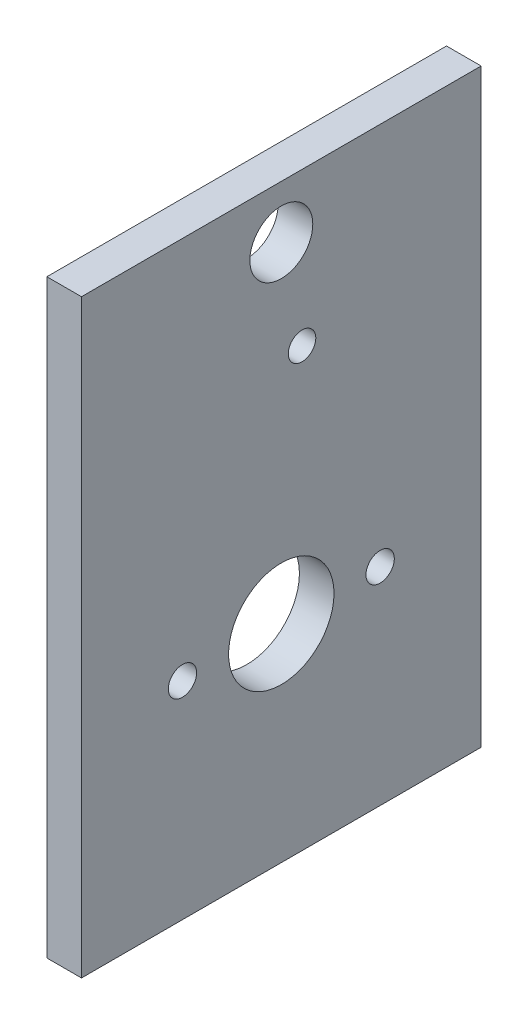
ISO-10303-21;
HEADER;
FILE_DESCRIPTION(('STEP AP214'),'2;1');
FILE_NAME('part.step','',(''),(''),'','','');
FILE_SCHEMA(('AUTOMOTIVE_DESIGN { 1 0 10303 214 1 1 1 1 }'));
ENDSEC;
DATA;
#1=APPLICATION_CONTEXT('core data for automotive mechanical design processes');
#2=APPLICATION_PROTOCOL_DEFINITION('international standard','automotive_design',2000,#1);
#3=PRODUCT_CONTEXT('',#1,'mechanical');
#4=PRODUCT('Part','Part','',(#3));
#5=PRODUCT_RELATED_PRODUCT_CATEGORY('part','',(#4));
#6=PRODUCT_DEFINITION_FORMATION('','',#4);
#7=PRODUCT_DEFINITION_CONTEXT('part definition',#1,'design');
#8=PRODUCT_DEFINITION('design','',#6,#7);
#9=PRODUCT_DEFINITION_SHAPE('','',#8);
#10=(LENGTH_UNIT() NAMED_UNIT(*) SI_UNIT(.MILLI.,.METRE.));
#11=(NAMED_UNIT(*) PLANE_ANGLE_UNIT() SI_UNIT($,.RADIAN.));
#12=(NAMED_UNIT(*) SI_UNIT($,.STERADIAN.) SOLID_ANGLE_UNIT());
#13=UNCERTAINTY_MEASURE_WITH_UNIT(LENGTH_MEASURE(1.E-05),#10,'distance_accuracy_value','');
#14=(GEOMETRIC_REPRESENTATION_CONTEXT(3) GLOBAL_UNCERTAINTY_ASSIGNED_CONTEXT((#13)) GLOBAL_UNIT_ASSIGNED_CONTEXT((#10,
#11,#12)) REPRESENTATION_CONTEXT('',''));
#15=CARTESIAN_POINT('',(0.,0.,0.));
#16=DIRECTION('',(0.,0.,1.));
#17=DIRECTION('',(1.,0.,0.));
#18=AXIS2_PLACEMENT_3D('',#15,#16,#17);
#19=CARTESIAN_POINT('',(4.4,-37.5,-25.4));
#20=DIRECTION('',(0.,0.,1.));
#21=DIRECTION('',(1.,0.,0.));
#22=AXIS2_PLACEMENT_3D('',#19,#20,#21);
#23=PLANE('',#22);
#24=DIRECTION('',(0.,1.,0.));
#25=VECTOR('',#24,1.);
#26=CARTESIAN_POINT('',(0.,-37.5,-25.4));
#27=LINE('',#26,#25);
#28=CARTESIAN_POINT('',(0.,-37.5,-25.4));
#29=VERTEX_POINT('',#28);
#30=CARTESIAN_POINT('',(0.,37.5,-25.4));
#31=VERTEX_POINT('',#30);
#32=EDGE_CURVE('E96',#29,#31,#27,.T.);
#33=ORIENTED_EDGE('',*,*,#32,.T.);
#34=DIRECTION('',(-1.,0.,0.));
#35=VECTOR('',#34,1.);
#36=CARTESIAN_POINT('',(4.4,37.5,-25.4));
#37=LINE('',#36,#35);
#38=CARTESIAN_POINT('',(4.4,37.5,-25.4));
#39=VERTEX_POINT('',#38);
#40=EDGE_CURVE('E11',#39,#31,#37,.T.);
#41=ORIENTED_EDGE('',*,*,#40,.F.);
#42=DIRECTION('',(0.,1.,0.));
#43=VECTOR('',#42,1.);
#44=CARTESIAN_POINT('',(4.4,-37.5,-25.4));
#45=LINE('',#44,#43);
#46=CARTESIAN_POINT('',(4.4,-37.5,-25.4));
#47=VERTEX_POINT('',#46);
#48=EDGE_CURVE('E84',#47,#39,#45,.T.);
#49=ORIENTED_EDGE('',*,*,#48,.F.);
#50=DIRECTION('',(-1.,0.,0.));
#51=VECTOR('',#50,1.);
#52=CARTESIAN_POINT('',(4.4,-37.5,-25.4));
#53=LINE('',#52,#51);
#54=EDGE_CURVE('E92',#47,#29,#53,.T.);
#55=ORIENTED_EDGE('',*,*,#54,.T.);
#56=EDGE_LOOP('',(#33,#41,#49,#55));
#57=FACE_BOUND('',#56,.T.);
#58=ADVANCED_FACE('F33',(#57),#23,.F.);
#59=CARTESIAN_POINT('',(4.4,37.5,25.4));
#60=DIRECTION('',(0.,-1.,0.));
#61=DIRECTION('',(0.,0.,-1.));
#62=AXIS2_PLACEMENT_3D('',#59,#60,#61);
#63=PLANE('',#62);
#64=DIRECTION('',(0.,0.,1.));
#65=VECTOR('',#64,1.);
#66=CARTESIAN_POINT('',(0.,37.5,25.4));
#67=LINE('',#66,#65);
#68=CARTESIAN_POINT('',(0.,37.5,25.4));
#69=VERTEX_POINT('',#68);
#70=EDGE_CURVE('E88',#31,#69,#67,.T.);
#71=ORIENTED_EDGE('',*,*,#70,.T.);
#72=DIRECTION('',(-1.,0.,0.));
#73=VECTOR('',#72,1.);
#74=CARTESIAN_POINT('',(4.4,37.5,25.4));
#75=LINE('',#74,#73);
#76=CARTESIAN_POINT('',(4.4,37.5,25.4));
#77=VERTEX_POINT('',#76);
#78=EDGE_CURVE('E41',#77,#69,#75,.T.);
#79=ORIENTED_EDGE('',*,*,#78,.F.);
#80=DIRECTION('',(0.,0.,1.));
#81=VECTOR('',#80,1.);
#82=CARTESIAN_POINT('',(4.4,37.5,25.4));
#83=LINE('',#82,#81);
#84=EDGE_CURVE('E79',#39,#77,#83,.T.);
#85=ORIENTED_EDGE('',*,*,#84,.F.);
#86=ORIENTED_EDGE('',*,*,#40,.T.);
#87=EDGE_LOOP('',(#71,#79,#85,#86));
#88=FACE_BOUND('',#87,.T.);
#89=ADVANCED_FACE('F87',(#88),#63,.F.);
#90=CARTESIAN_POINT('',(4.4,-37.5,25.4));
#91=DIRECTION('',(0.,0.,-1.));
#92=DIRECTION('',(-1.,0.,0.));
#93=AXIS2_PLACEMENT_3D('',#90,#91,#92);
#94=PLANE('',#93);
#95=DIRECTION('',(0.,-1.,0.));
#96=VECTOR('',#95,1.);
#97=CARTESIAN_POINT('',(0.,-37.5,25.4));
#98=LINE('',#97,#96);
#99=CARTESIAN_POINT('',(0.,-37.5,25.4));
#100=VERTEX_POINT('',#99);
#101=EDGE_CURVE('E66',#69,#100,#98,.T.);
#102=ORIENTED_EDGE('',*,*,#101,.T.);
#103=DIRECTION('',(-1.,0.,0.));
#104=VECTOR('',#103,1.);
#105=CARTESIAN_POINT('',(4.4,-37.5,25.4));
#106=LINE('',#105,#104);
#107=CARTESIAN_POINT('',(4.4,-37.5,25.4));
#108=VERTEX_POINT('',#107);
#109=EDGE_CURVE('E89',#108,#100,#106,.T.);
#110=ORIENTED_EDGE('',*,*,#109,.F.);
#111=DIRECTION('',(0.,-1.,0.));
#112=VECTOR('',#111,1.);
#113=CARTESIAN_POINT('',(4.4,-37.5,25.4));
#114=LINE('',#113,#112);
#115=EDGE_CURVE('E82',#77,#108,#114,.T.);
#116=ORIENTED_EDGE('',*,*,#115,.F.);
#117=ORIENTED_EDGE('',*,*,#78,.T.);
#118=EDGE_LOOP('',(#102,#110,#116,#117));
#119=FACE_BOUND('',#118,.T.);
#120=ADVANCED_FACE('F90',(#119),#94,.F.);
#121=CARTESIAN_POINT('',(4.4,-37.5,25.4));
#122=DIRECTION('',(0.,1.,0.));
#123=DIRECTION('',(0.,0.,1.));
#124=AXIS2_PLACEMENT_3D('',#121,#122,#123);
#125=PLANE('',#124);
#126=DIRECTION('',(0.,0.,-1.));
#127=VECTOR('',#126,1.);
#128=CARTESIAN_POINT('',(0.,-37.5,25.4));
#129=LINE('',#128,#127);
#130=EDGE_CURVE('E72',#100,#29,#129,.T.);
#131=ORIENTED_EDGE('',*,*,#130,.T.);
#132=ORIENTED_EDGE('',*,*,#54,.F.);
#133=DIRECTION('',(0.,0.,-1.));
#134=VECTOR('',#133,1.);
#135=CARTESIAN_POINT('',(4.4,-37.5,25.4));
#136=LINE('',#135,#134);
#137=EDGE_CURVE('E49',#108,#47,#136,.T.);
#138=ORIENTED_EDGE('',*,*,#137,.F.);
#139=ORIENTED_EDGE('',*,*,#109,.T.);
#140=EDGE_LOOP('',(#131,#132,#138,#139));
#141=FACE_BOUND('',#140,.T.);
#142=ADVANCED_FACE('F104',(#141),#125,.F.);
#143=CARTESIAN_POINT('',(4.4,0.,0.));
#144=DIRECTION('',(-1.,0.,0.));
#145=DIRECTION('',(0.,0.,1.));
#146=AXIS2_PLACEMENT_3D('',#143,#144,#145);
#147=PLANE('',#146);
#148=CARTESIAN_POINT('',(4.4,18.069503628223,-2.63504704039778));
#149=DIRECTION('',(1.,0.,0.));
#150=DIRECTION('',(0.,0.,-1.));
#151=AXIS2_PLACEMENT_3D('',#148,#149,#150);
#152=CIRCLE('',#151,1.75);
#153=CARTESIAN_POINT('',(4.4,18.069503628223,-4.38504704039778));
#154=VERTEX_POINT('',#153);
#155=EDGE_CURVE('E134',#154,#154,#152,.T.);
#156=ORIENTED_EDGE('',*,*,#155,.F.);
#157=EDGE_LOOP('',(#156));
#158=FACE_BOUND('',#157,.T.);
#159=CARTESIAN_POINT('',(4.4,-11.205496371777,-12.565));
#160=DIRECTION('',(1.,0.,0.));
#161=DIRECTION('',(0.,0.,-1.));
#162=AXIS2_PLACEMENT_3D('',#159,#160,#161);
#163=CIRCLE('',#162,1.8);
#164=CARTESIAN_POINT('',(4.4,-11.205496371777,-14.365));
#165=VERTEX_POINT('',#164);
#166=EDGE_CURVE('E122',#165,#165,#163,.T.);
#167=ORIENTED_EDGE('',*,*,#166,.F.);
#168=EDGE_LOOP('',(#167));
#169=FACE_BOUND('',#168,.T.);
#170=CARTESIAN_POINT('',(4.4,-11.205496371777,12.565));
#171=DIRECTION('',(1.,0.,0.));
#172=DIRECTION('',(0.,0.,-1.));
#173=AXIS2_PLACEMENT_3D('',#170,#171,#172);
#174=CIRCLE('',#173,1.8);
#175=CARTESIAN_POINT('',(4.4,-11.205496371777,10.765));
#176=VERTEX_POINT('',#175);
#177=EDGE_CURVE('E129',#176,#176,#174,.T.);
#178=ORIENTED_EDGE('',*,*,#177,.F.);
#179=EDGE_LOOP('',(#178));
#180=FACE_BOUND('',#179,.T.);
#181=CARTESIAN_POINT('',(4.4,-11.205496371777,0.));
#182=DIRECTION('',(1.,0.,0.));
#183=DIRECTION('',(0.,0.,-1.));
#184=AXIS2_PLACEMENT_3D('',#181,#182,#183);
#185=CIRCLE('',#184,6.7);
#186=CARTESIAN_POINT('',(4.4,-11.205496371777,-6.7));
#187=VERTEX_POINT('',#186);
#188=EDGE_CURVE('E116',#187,#187,#185,.T.);
#189=ORIENTED_EDGE('',*,*,#188,.F.);
#190=EDGE_LOOP('',(#189));
#191=FACE_BOUND('',#190,.T.);
#192=CARTESIAN_POINT('',(4.4,30.794503628223,0.));
#193=DIRECTION('',(1.,0.,0.));
#194=DIRECTION('',(0.,0.,-1.));
#195=AXIS2_PLACEMENT_3D('',#192,#193,#194);
#196=CIRCLE('',#195,4.00000000000001);
#197=CARTESIAN_POINT('',(4.4,30.794503628223,-4.00000000000001));
#198=VERTEX_POINT('',#197);
#199=EDGE_CURVE('E110',#198,#198,#196,.T.);
#200=ORIENTED_EDGE('',*,*,#199,.F.);
#201=EDGE_LOOP('',(#200));
#202=FACE_BOUND('',#201,.T.);
#203=ORIENTED_EDGE('',*,*,#48,.T.);
#204=ORIENTED_EDGE('',*,*,#84,.T.);
#205=ORIENTED_EDGE('',*,*,#115,.T.);
#206=ORIENTED_EDGE('',*,*,#137,.T.);
#207=EDGE_LOOP('',(#203,#204,#205,#206));
#208=FACE_BOUND('',#207,.T.);
#209=ADVANCED_FACE('F80',(#158,#169,#180,#191,#202,#208),#147,.F.);
#210=CARTESIAN_POINT('',(0.,0.,0.));
#211=DIRECTION('',(-1.,0.,0.));
#212=DIRECTION('',(0.,0.,1.));
#213=AXIS2_PLACEMENT_3D('',#210,#211,#212);
#214=PLANE('',#213);
#215=CARTESIAN_POINT('',(0.,18.069503628223,-2.63504704039778));
#216=DIRECTION('',(1.,0.,0.));
#217=DIRECTION('',(0.,0.,-1.));
#218=AXIS2_PLACEMENT_3D('',#215,#216,#217);
#219=CIRCLE('',#218,1.75);
#220=CARTESIAN_POINT('',(0.,18.069503628223,-4.38504704039778));
#221=VERTEX_POINT('',#220);
#222=EDGE_CURVE('E126',#221,#221,#219,.T.);
#223=ORIENTED_EDGE('',*,*,#222,.T.);
#224=EDGE_LOOP('',(#223));
#225=FACE_BOUND('',#224,.T.);
#226=CARTESIAN_POINT('',(0.,-11.205496371777,-12.565));
#227=DIRECTION('',(1.,0.,0.));
#228=DIRECTION('',(0.,0.,-1.));
#229=AXIS2_PLACEMENT_3D('',#226,#227,#228);
#230=CIRCLE('',#229,1.8);
#231=CARTESIAN_POINT('',(0.,-11.205496371777,-14.365));
#232=VERTEX_POINT('',#231);
#233=EDGE_CURVE('E125',#232,#232,#230,.T.);
#234=ORIENTED_EDGE('',*,*,#233,.T.);
#235=EDGE_LOOP('',(#234));
#236=FACE_BOUND('',#235,.T.);
#237=CARTESIAN_POINT('',(0.,-11.205496371777,12.565));
#238=DIRECTION('',(1.,0.,0.));
#239=DIRECTION('',(0.,0.,-1.));
#240=AXIS2_PLACEMENT_3D('',#237,#238,#239);
#241=CIRCLE('',#240,1.8);
#242=CARTESIAN_POINT('',(0.,-11.205496371777,10.765));
#243=VERTEX_POINT('',#242);
#244=EDGE_CURVE('E119',#243,#243,#241,.T.);
#245=ORIENTED_EDGE('',*,*,#244,.T.);
#246=EDGE_LOOP('',(#245));
#247=FACE_BOUND('',#246,.T.);
#248=CARTESIAN_POINT('',(0.,-11.205496371777,0.));
#249=DIRECTION('',(1.,0.,0.));
#250=DIRECTION('',(0.,0.,-1.));
#251=AXIS2_PLACEMENT_3D('',#248,#249,#250);
#252=CIRCLE('',#251,6.7);
#253=CARTESIAN_POINT('',(0.,-11.205496371777,-6.7));
#254=VERTEX_POINT('',#253);
#255=EDGE_CURVE('E113',#254,#254,#252,.T.);
#256=ORIENTED_EDGE('',*,*,#255,.T.);
#257=EDGE_LOOP('',(#256));
#258=FACE_BOUND('',#257,.T.);
#259=CARTESIAN_POINT('',(0.,30.794503628223,0.));
#260=DIRECTION('',(1.,0.,0.));
#261=DIRECTION('',(0.,0.,-1.));
#262=AXIS2_PLACEMENT_3D('',#259,#260,#261);
#263=CIRCLE('',#262,4.00000000000001);
#264=CARTESIAN_POINT('',(0.,30.794503628223,-4.00000000000001));
#265=VERTEX_POINT('',#264);
#266=EDGE_CURVE('E99',#265,#265,#263,.T.);
#267=ORIENTED_EDGE('',*,*,#266,.T.);
#268=EDGE_LOOP('',(#267));
#269=FACE_BOUND('',#268,.T.);
#270=ORIENTED_EDGE('',*,*,#32,.F.);
#271=ORIENTED_EDGE('',*,*,#130,.F.);
#272=ORIENTED_EDGE('',*,*,#101,.F.);
#273=ORIENTED_EDGE('',*,*,#70,.F.);
#274=EDGE_LOOP('',(#270,#271,#272,#273));
#275=FACE_BOUND('',#274,.T.);
#276=ADVANCED_FACE('F107',(#225,#236,#247,#258,#269,#275),#214,.T.);
#277=CARTESIAN_POINT('',(0.,30.794503628223,0.));
#278=DIRECTION('',(1.,0.,0.));
#279=DIRECTION('',(0.,0.,-1.));
#280=AXIS2_PLACEMENT_3D('',#277,#278,#279);
#281=CYLINDRICAL_SURFACE('',#280,4.00000000000001);
#282=ORIENTED_EDGE('',*,*,#266,.F.);
#283=EDGE_LOOP('',(#282));
#284=FACE_BOUND('',#283,.T.);
#285=ORIENTED_EDGE('',*,*,#199,.T.);
#286=EDGE_LOOP('',(#285));
#287=FACE_BOUND('',#286,.T.);
#288=ADVANCED_FACE('F160',(#284,#287),#281,.F.);
#289=CARTESIAN_POINT('',(0.,-11.205496371777,0.));
#290=DIRECTION('',(1.,0.,0.));
#291=DIRECTION('',(0.,0.,-1.));
#292=AXIS2_PLACEMENT_3D('',#289,#290,#291);
#293=CYLINDRICAL_SURFACE('',#292,6.7);
#294=ORIENTED_EDGE('',*,*,#255,.F.);
#295=EDGE_LOOP('',(#294));
#296=FACE_BOUND('',#295,.T.);
#297=ORIENTED_EDGE('',*,*,#188,.T.);
#298=EDGE_LOOP('',(#297));
#299=FACE_BOUND('',#298,.T.);
#300=ADVANCED_FACE('F162',(#296,#299),#293,.F.);
#301=CARTESIAN_POINT('',(0.,-11.205496371777,12.565));
#302=DIRECTION('',(1.,0.,0.));
#303=DIRECTION('',(0.,0.,-1.));
#304=AXIS2_PLACEMENT_3D('',#301,#302,#303);
#305=CYLINDRICAL_SURFACE('',#304,1.8);
#306=ORIENTED_EDGE('',*,*,#244,.F.);
#307=EDGE_LOOP('',(#306));
#308=FACE_BOUND('',#307,.T.);
#309=ORIENTED_EDGE('',*,*,#177,.T.);
#310=EDGE_LOOP('',(#309));
#311=FACE_BOUND('',#310,.T.);
#312=ADVANCED_FACE('F169',(#308,#311),#305,.F.);
#313=CARTESIAN_POINT('',(0.,-11.205496371777,-12.565));
#314=DIRECTION('',(1.,0.,0.));
#315=DIRECTION('',(0.,0.,-1.));
#316=AXIS2_PLACEMENT_3D('',#313,#314,#315);
#317=CYLINDRICAL_SURFACE('',#316,1.8);
#318=ORIENTED_EDGE('',*,*,#233,.F.);
#319=EDGE_LOOP('',(#318));
#320=FACE_BOUND('',#319,.T.);
#321=ORIENTED_EDGE('',*,*,#166,.T.);
#322=EDGE_LOOP('',(#321));
#323=FACE_BOUND('',#322,.T.);
#324=ADVANCED_FACE('F145',(#320,#323),#317,.F.);
#325=CARTESIAN_POINT('',(0.,18.069503628223,-2.63504704039778));
#326=DIRECTION('',(1.,0.,0.));
#327=DIRECTION('',(0.,0.,-1.));
#328=AXIS2_PLACEMENT_3D('',#325,#326,#327);
#329=CYLINDRICAL_SURFACE('',#328,1.75);
#330=ORIENTED_EDGE('',*,*,#222,.F.);
#331=EDGE_LOOP('',(#330));
#332=FACE_BOUND('',#331,.T.);
#333=ORIENTED_EDGE('',*,*,#155,.T.);
#334=EDGE_LOOP('',(#333));
#335=FACE_BOUND('',#334,.T.);
#336=ADVANCED_FACE('F142',(#332,#335),#329,.F.);
#337=CLOSED_SHELL('',(#58,#89,#120,#142,#209,#276,#288,#300,#312,#324,#336));
#338=MANIFOLD_SOLID_BREP('B2',#337);
#339=ADVANCED_BREP_SHAPE_REPRESENTATION('',(#18,#338),#14);
#340=SHAPE_DEFINITION_REPRESENTATION(#9,#339);
ENDSEC;
END-ISO-10303-21;
